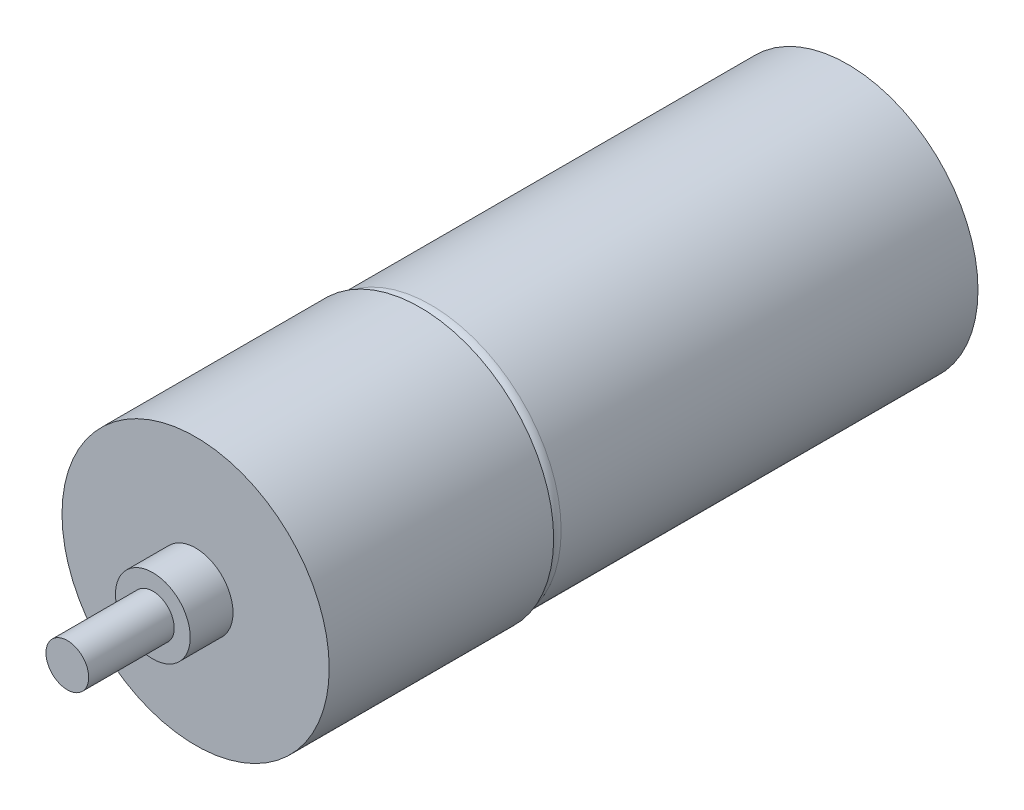
ISO-10303-21;
HEADER;
FILE_DESCRIPTION(('STEP AP214'),'2;1');
FILE_NAME('part.step','',(''),(''),'','','');
FILE_SCHEMA(('AUTOMOTIVE_DESIGN { 1 0 10303 214 1 1 1 1 }'));
ENDSEC;
DATA;
#1=APPLICATION_CONTEXT('core data for automotive mechanical design processes');
#2=APPLICATION_PROTOCOL_DEFINITION('international standard','automotive_design',2000,#1);
#3=PRODUCT_CONTEXT('',#1,'mechanical');
#4=PRODUCT('Part','Part','',(#3));
#5=PRODUCT_RELATED_PRODUCT_CATEGORY('part','',(#4));
#6=PRODUCT_DEFINITION_FORMATION('','',#4);
#7=PRODUCT_DEFINITION_CONTEXT('part definition',#1,'design');
#8=PRODUCT_DEFINITION('design','',#6,#7);
#9=PRODUCT_DEFINITION_SHAPE('','',#8);
#10=(LENGTH_UNIT() NAMED_UNIT(*) SI_UNIT(.MILLI.,.METRE.));
#11=(NAMED_UNIT(*) PLANE_ANGLE_UNIT() SI_UNIT($,.RADIAN.));
#12=(NAMED_UNIT(*) SI_UNIT($,.STERADIAN.) SOLID_ANGLE_UNIT());
#13=UNCERTAINTY_MEASURE_WITH_UNIT(LENGTH_MEASURE(1.E-05),#10,'distance_accuracy_value','');
#14=(GEOMETRIC_REPRESENTATION_CONTEXT(3) GLOBAL_UNCERTAINTY_ASSIGNED_CONTEXT((#13)) GLOBAL_UNIT_ASSIGNED_CONTEXT((#10,
#11,#12)) REPRESENTATION_CONTEXT('',''));
#15=CARTESIAN_POINT('',(0.,0.,0.));
#16=DIRECTION('',(0.,0.,1.));
#17=DIRECTION('',(1.,0.,0.));
#18=AXIS2_PLACEMENT_3D('',#15,#16,#17);
#19=CARTESIAN_POINT('',(0.,0.,56.));
#20=DIRECTION('',(0.,0.,1.));
#21=DIRECTION('',(1.,0.,0.));
#22=AXIS2_PLACEMENT_3D('',#19,#20,#21);
#23=PLANE('',#22);
#24=CARTESIAN_POINT('',(0.,0.,56.));
#25=DIRECTION('',(0.,0.,1.));
#26=DIRECTION('',(1.,0.,0.));
#27=AXIS2_PLACEMENT_3D('',#24,#25,#26);
#28=CIRCLE('',#27,3.5);
#29=CARTESIAN_POINT('',(3.5,0.,56.));
#30=VERTEX_POINT('',#29);
#31=EDGE_CURVE('E49',#30,#30,#28,.T.);
#32=ORIENTED_EDGE('',*,*,#31,.T.);
#33=EDGE_LOOP('',(#32));
#34=FACE_BOUND('',#33,.T.);
#35=CARTESIAN_POINT('',(0.,0.,56.));
#36=DIRECTION('',(0.,0.,1.));
#37=DIRECTION('',(1.,0.,0.));
#38=AXIS2_PLACEMENT_3D('',#35,#36,#37);
#39=CIRCLE('',#38,2.);
#40=CARTESIAN_POINT('',(2.,0.,56.));
#41=VERTEX_POINT('',#40);
#42=EDGE_CURVE('E58',#41,#41,#39,.T.);
#43=ORIENTED_EDGE('',*,*,#42,.F.);
#44=EDGE_LOOP('',(#43));
#45=FACE_BOUND('',#44,.T.);
#46=ADVANCED_FACE('F31',(#34,#45),#23,.T.);
#47=CARTESIAN_POINT('',(0.,0.,52.));
#48=DIRECTION('',(0.,0.,1.));
#49=DIRECTION('',(1.,0.,0.));
#50=AXIS2_PLACEMENT_3D('',#47,#48,#49);
#51=PLANE('',#50);
#52=CARTESIAN_POINT('',(0.,0.,52.));
#53=DIRECTION('',(0.,0.,1.));
#54=DIRECTION('',(1.,0.,0.));
#55=AXIS2_PLACEMENT_3D('',#52,#53,#54);
#56=CIRCLE('',#55,12.5);
#57=CARTESIAN_POINT('',(-12.5,0.,52.));
#58=VERTEX_POINT('',#57);
#59=EDGE_CURVE('E43',#58,#58,#56,.T.);
#60=ORIENTED_EDGE('',*,*,#59,.T.);
#61=EDGE_LOOP('',(#60));
#62=FACE_BOUND('',#61,.T.);
#63=CARTESIAN_POINT('',(0.,0.,52.));
#64=DIRECTION('',(0.,0.,1.));
#65=DIRECTION('',(1.,0.,0.));
#66=AXIS2_PLACEMENT_3D('',#63,#64,#65);
#67=CIRCLE('',#66,3.5);
#68=CARTESIAN_POINT('',(3.5,0.,52.));
#69=VERTEX_POINT('',#68);
#70=EDGE_CURVE('E52',#69,#69,#67,.T.);
#71=ORIENTED_EDGE('',*,*,#70,.F.);
#72=EDGE_LOOP('',(#71));
#73=FACE_BOUND('',#72,.T.);
#74=ADVANCED_FACE('F74',(#62,#73),#51,.T.);
#75=CARTESIAN_POINT('',(0.,0.,31.));
#76=DIRECTION('',(0.,0.,-1.));
#77=DIRECTION('',(-1.,0.,0.));
#78=AXIS2_PLACEMENT_3D('',#75,#76,#77);
#79=CYLINDRICAL_SURFACE('',#78,12.2);
#80=CARTESIAN_POINT('',(0.,0.,-8.99999999999999));
#81=DIRECTION('',(0.,0.,1.));
#82=DIRECTION('',(1.,0.,0.));
#83=AXIS2_PLACEMENT_3D('',#80,#81,#82);
#84=CIRCLE('',#83,12.2);
#85=CARTESIAN_POINT('',(12.2,0.,-8.99999999999999));
#86=VERTEX_POINT('',#85);
#87=EDGE_CURVE('E35',#86,#86,#84,.T.);
#88=ORIENTED_EDGE('',*,*,#87,.T.);
#89=EDGE_LOOP('',(#88));
#90=FACE_BOUND('',#89,.T.);
#91=CARTESIAN_POINT('',(0.,0.,30.));
#92=DIRECTION('',(0.,0.,1.));
#93=DIRECTION('',(1.,0.,0.));
#94=AXIS2_PLACEMENT_3D('',#91,#92,#93);
#95=CIRCLE('',#94,12.2);
#96=CARTESIAN_POINT('',(12.2,0.,30.));
#97=VERTEX_POINT('',#96);
#98=EDGE_CURVE('E10',#97,#97,#95,.F.);
#99=ORIENTED_EDGE('',*,*,#98,.T.);
#100=EDGE_LOOP('',(#99));
#101=FACE_BOUND('',#100,.T.);
#102=ADVANCED_FACE('F80',(#90,#101),#79,.T.);
#103=CARTESIAN_POINT('',(0.,0.,30.));
#104=DIRECTION('',(0.,0.,1.));
#105=DIRECTION('',(1.,0.,0.));
#106=AXIS2_PLACEMENT_3D('',#103,#104,#105);
#107=TOROIDAL_SURFACE('',#106,11.2,1.);
#108=ORIENTED_EDGE('',*,*,#98,.F.);
#109=EDGE_LOOP('',(#108));
#110=FACE_BOUND('',#109,.T.);
#111=CARTESIAN_POINT('',(0.,0.,31.));
#112=DIRECTION('',(0.,0.,1.));
#113=DIRECTION('',(1.,0.,0.));
#114=AXIS2_PLACEMENT_3D('',#111,#112,#113);
#115=CIRCLE('',#114,11.2);
#116=CARTESIAN_POINT('',(11.2,0.,31.));
#117=VERTEX_POINT('',#116);
#118=EDGE_CURVE('E39',#117,#117,#115,.T.);
#119=ORIENTED_EDGE('',*,*,#118,.F.);
#120=EDGE_LOOP('',(#119));
#121=FACE_BOUND('',#120,.T.);
#122=ADVANCED_FACE('F33',(#110,#121),#107,.T.);
#123=CARTESIAN_POINT('',(0.,0.,52.));
#124=DIRECTION('',(0.,0.,-1.));
#125=DIRECTION('',(-1.,0.,0.));
#126=AXIS2_PLACEMENT_3D('',#123,#124,#125);
#127=CYLINDRICAL_SURFACE('',#126,12.5);
#128=CARTESIAN_POINT('',(0.,0.,31.));
#129=DIRECTION('',(0.,0.,1.));
#130=DIRECTION('',(1.,0.,0.));
#131=AXIS2_PLACEMENT_3D('',#128,#129,#130);
#132=CIRCLE('',#131,12.5);
#133=CARTESIAN_POINT('',(-12.5,0.,31.));
#134=VERTEX_POINT('',#133);
#135=EDGE_CURVE('E46',#134,#134,#132,.T.);
#136=CARTESIAN_POINT('',(-12.5,0.,52.));
#137=CARTESIAN_POINT('',(-12.5,0.,51.78125));
#138=CARTESIAN_POINT('',(-12.5,0.,51.5625));
#139=CARTESIAN_POINT('',(-12.5,0.,51.125));
#140=CARTESIAN_POINT('',(-12.5,0.,50.90625));
#141=CARTESIAN_POINT('',(-12.5,0.,50.46875));
#142=CARTESIAN_POINT('',(-12.5,0.,50.25));
#143=CARTESIAN_POINT('',(-12.5,0.,49.8125));
#144=CARTESIAN_POINT('',(-12.5,0.,49.59375));
#145=CARTESIAN_POINT('',(-12.5,0.,49.15625));
#146=CARTESIAN_POINT('',(-12.5,0.,48.9375));
#147=CARTESIAN_POINT('',(-12.5,0.,48.5));
#148=CARTESIAN_POINT('',(-12.5,0.,48.28125));
#149=CARTESIAN_POINT('',(-12.5,0.,47.84375));
#150=CARTESIAN_POINT('',(-12.5,0.,47.625));
#151=CARTESIAN_POINT('',(-12.5,0.,47.1875));
#152=CARTESIAN_POINT('',(-12.5,0.,46.96875));
#153=CARTESIAN_POINT('',(-12.5,0.,46.53125));
#154=CARTESIAN_POINT('',(-12.5,0.,46.3125));
#155=CARTESIAN_POINT('',(-12.5,0.,45.875));
#156=CARTESIAN_POINT('',(-12.5,0.,45.65625));
#157=CARTESIAN_POINT('',(-12.5,0.,45.21875));
#158=CARTESIAN_POINT('',(-12.5,0.,45.));
#159=CARTESIAN_POINT('',(-12.5,0.,44.5625));
#160=CARTESIAN_POINT('',(-12.5,0.,44.34375));
#161=CARTESIAN_POINT('',(-12.5,0.,43.90625));
#162=CARTESIAN_POINT('',(-12.5,0.,43.6875));
#163=CARTESIAN_POINT('',(-12.5,0.,43.25));
#164=CARTESIAN_POINT('',(-12.5,0.,43.03125));
#165=CARTESIAN_POINT('',(-12.5,0.,42.59375));
#166=CARTESIAN_POINT('',(-12.5,0.,42.375));
#167=CARTESIAN_POINT('',(-12.5,0.,41.9375));
#168=CARTESIAN_POINT('',(-12.5,0.,41.71875));
#169=CARTESIAN_POINT('',(-12.5,0.,41.28125));
#170=CARTESIAN_POINT('',(-12.5,0.,41.0625));
#171=CARTESIAN_POINT('',(-12.5,0.,40.625));
#172=CARTESIAN_POINT('',(-12.5,0.,40.40625));
#173=CARTESIAN_POINT('',(-12.5,0.,39.96875));
#174=CARTESIAN_POINT('',(-12.5,0.,39.75));
#175=CARTESIAN_POINT('',(-12.5,0.,39.3125));
#176=CARTESIAN_POINT('',(-12.5,0.,39.09375));
#177=CARTESIAN_POINT('',(-12.5,0.,38.65625));
#178=CARTESIAN_POINT('',(-12.5,0.,38.4375));
#179=CARTESIAN_POINT('',(-12.5,0.,38.));
#180=CARTESIAN_POINT('',(-12.5,0.,37.78125));
#181=CARTESIAN_POINT('',(-12.5,0.,37.34375));
#182=CARTESIAN_POINT('',(-12.5,0.,37.125));
#183=CARTESIAN_POINT('',(-12.5,0.,36.6875));
#184=CARTESIAN_POINT('',(-12.5,0.,36.46875));
#185=CARTESIAN_POINT('',(-12.5,0.,36.03125));
#186=CARTESIAN_POINT('',(-12.5,0.,35.8125));
#187=CARTESIAN_POINT('',(-12.5,0.,35.375));
#188=CARTESIAN_POINT('',(-12.5,0.,35.15625));
#189=CARTESIAN_POINT('',(-12.5,0.,34.71875));
#190=CARTESIAN_POINT('',(-12.5,0.,34.5));
#191=CARTESIAN_POINT('',(-12.5,0.,34.0625));
#192=CARTESIAN_POINT('',(-12.5,0.,33.84375));
#193=CARTESIAN_POINT('',(-12.5,0.,33.40625));
#194=CARTESIAN_POINT('',(-12.5,0.,33.1875));
#195=CARTESIAN_POINT('',(-12.5,0.,32.75));
#196=CARTESIAN_POINT('',(-12.5,0.,32.53125));
#197=CARTESIAN_POINT('',(-12.5,0.,32.09375));
#198=CARTESIAN_POINT('',(-12.5,0.,31.875));
#199=CARTESIAN_POINT('',(-12.5,0.,31.4375));
#200=CARTESIAN_POINT('',(-12.5,0.,31.21875));
#201=CARTESIAN_POINT('',(-12.5,0.,31.));
#202=B_SPLINE_CURVE_WITH_KNOTS('',3,(#136,#137,#138,#139,#140,#141,#142,#143,#144,#145,#146,
#147,#148,#149,#150,#151,#152,#153,#154,#155,#156,#157,#158,#159,#160,#161,#162,#163,#164,#165,
#166,#167,#168,#169,#170,#171,#172,#173,#174,#175,#176,#177,#178,#179,#180,#181,#182,#183,#184,
#185,#186,#187,#188,#189,#190,#191,#192,#193,#194,#195,#196,#197,#198,#199,#200,#201),
.UNSPECIFIED.,.F.,.F.,(4,2,2,2,2,2,2,2,2,2,2,2,2,2,2,2,2,2,2,2,2,2,2,2,2,2,2,2,2,2,2,2,4),(0.,
0.656250000000004,1.3125,1.96875000000001,2.625,3.28125000000001,3.9375,4.59375000000001,5.25,
5.90625,6.56250000000001,7.21875,7.87500000000001,8.53125,9.1875,9.84375000000001,10.5,11.15625,
11.8125,12.46875,13.125,13.78125,14.4375,15.09375,15.75,16.40625,17.0625,17.71875,18.375,
19.03125,19.6875,20.34375,21.),.UNSPECIFIED.);
#203=EDGE_CURVE('BSEAM91',#58,#134,#202,.T.);
#204=ORIENTED_EDGE('',*,*,#59,.F.);
#205=ORIENTED_EDGE('',*,*,#135,.T.);
#206=ORIENTED_EDGE('',*,*,#203,.T.);
#207=ORIENTED_EDGE('',*,*,#203,.F.);
#208=EDGE_LOOP('',(#204,#206,#205,#207));
#209=FACE_BOUND('',#208,.T.);
#210=ADVANCED_FACE('F91',(#209),#127,.T.);
#211=CARTESIAN_POINT('',(0.,0.,31.));
#212=DIRECTION('',(0.,0.,1.));
#213=DIRECTION('',(1.,0.,0.));
#214=AXIS2_PLACEMENT_3D('',#211,#212,#213);
#215=PLANE('',#214);
#216=ORIENTED_EDGE('',*,*,#118,.T.);
#217=EDGE_LOOP('',(#216));
#218=FACE_BOUND('',#217,.T.);
#219=ORIENTED_EDGE('',*,*,#135,.F.);
#220=EDGE_LOOP('',(#219));
#221=FACE_BOUND('',#220,.T.);
#222=ADVANCED_FACE('F86',(#218,#221),#215,.F.);
#223=CARTESIAN_POINT('',(0.,0.,56.));
#224=DIRECTION('',(0.,0.,-1.));
#225=DIRECTION('',(-1.,0.,0.));
#226=AXIS2_PLACEMENT_3D('',#223,#224,#225);
#227=CYLINDRICAL_SURFACE('',#226,3.5);
#228=ORIENTED_EDGE('',*,*,#31,.F.);
#229=EDGE_LOOP('',(#228));
#230=FACE_BOUND('',#229,.T.);
#231=ORIENTED_EDGE('',*,*,#70,.T.);
#232=EDGE_LOOP('',(#231));
#233=FACE_BOUND('',#232,.T.);
#234=ADVANCED_FACE('F69',(#230,#233),#227,.T.);
#235=CARTESIAN_POINT('',(0.,0.,64.));
#236=DIRECTION('',(0.,0.,-1.));
#237=DIRECTION('',(-1.,0.,0.));
#238=AXIS2_PLACEMENT_3D('',#235,#236,#237);
#239=CYLINDRICAL_SURFACE('',#238,2.);
#240=CARTESIAN_POINT('',(0.,0.,64.));
#241=DIRECTION('',(0.,0.,1.));
#242=DIRECTION('',(1.,0.,0.));
#243=AXIS2_PLACEMENT_3D('',#240,#241,#242);
#244=CIRCLE('',#243,2.);
#245=CARTESIAN_POINT('',(2.,0.,64.));
#246=VERTEX_POINT('',#245);
#247=EDGE_CURVE('E55',#246,#246,#244,.T.);
#248=ORIENTED_EDGE('',*,*,#247,.F.);
#249=EDGE_LOOP('',(#248));
#250=FACE_BOUND('',#249,.T.);
#251=ORIENTED_EDGE('',*,*,#42,.T.);
#252=EDGE_LOOP('',(#251));
#253=FACE_BOUND('',#252,.T.);
#254=ADVANCED_FACE('F66',(#250,#253),#239,.T.);
#255=CARTESIAN_POINT('',(0.,0.,64.));
#256=DIRECTION('',(0.,0.,1.));
#257=DIRECTION('',(1.,0.,0.));
#258=AXIS2_PLACEMENT_3D('',#255,#256,#257);
#259=PLANE('',#258);
#260=ORIENTED_EDGE('',*,*,#247,.T.);
#261=EDGE_LOOP('',(#260));
#262=FACE_BOUND('',#261,.T.);
#263=ADVANCED_FACE('F64',(#262),#259,.T.);
#264=CARTESIAN_POINT('',(20.,0.,-8.99999999999999));
#265=DIRECTION('',(0.,0.,1.));
#266=DIRECTION('',(1.,0.,0.));
#267=AXIS2_PLACEMENT_3D('',#264,#265,#266);
#268=PLANE('',#267);
#269=ORIENTED_EDGE('',*,*,#87,.F.);
#270=EDGE_LOOP('',(#269));
#271=FACE_BOUND('',#270,.T.);
#272=ADVANCED_FACE('F104',(#271),#268,.F.);
#273=CLOSED_SHELL('',(#46,#74,#102,#122,#210,#222,#234,#254,#263,#272));
#274=MANIFOLD_SOLID_BREP('B2',#273);
#275=ADVANCED_BREP_SHAPE_REPRESENTATION('',(#18,#274),#14);
#276=SHAPE_DEFINITION_REPRESENTATION(#9,#275);
ENDSEC;
END-ISO-10303-21;
